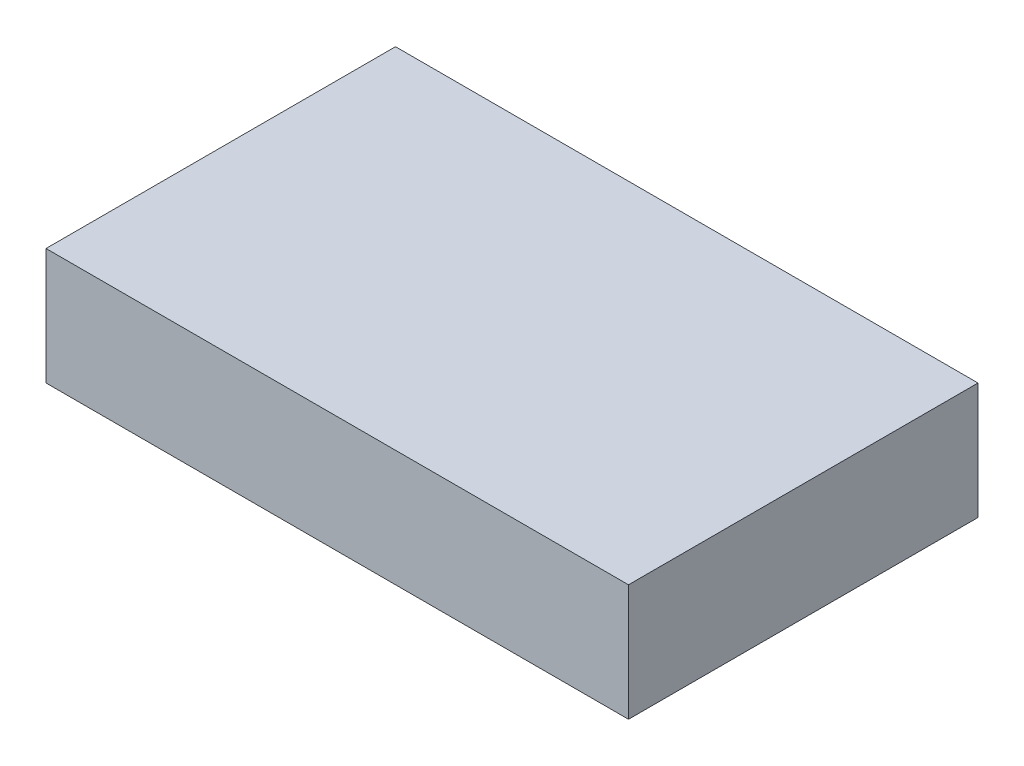
ISO-10303-21;
HEADER;
FILE_DESCRIPTION(('STEP AP214'),'2;1');
FILE_NAME('part.step','',(''),(''),'','','');
FILE_SCHEMA(('AUTOMOTIVE_DESIGN { 1 0 10303 214 1 1 1 1 }'));
ENDSEC;
DATA;
#1=APPLICATION_CONTEXT('core data for automotive mechanical design processes');
#2=APPLICATION_PROTOCOL_DEFINITION('international standard','automotive_design',2000,#1);
#3=PRODUCT_CONTEXT('',#1,'mechanical');
#4=PRODUCT('Part','Part','',(#3));
#5=PRODUCT_RELATED_PRODUCT_CATEGORY('part','',(#4));
#6=PRODUCT_DEFINITION_FORMATION('','',#4);
#7=PRODUCT_DEFINITION_CONTEXT('part definition',#1,'design');
#8=PRODUCT_DEFINITION('design','',#6,#7);
#9=PRODUCT_DEFINITION_SHAPE('','',#8);
#10=(LENGTH_UNIT() NAMED_UNIT(*) SI_UNIT(.MILLI.,.METRE.));
#11=(NAMED_UNIT(*) PLANE_ANGLE_UNIT() SI_UNIT($,.RADIAN.));
#12=(NAMED_UNIT(*) SI_UNIT($,.STERADIAN.) SOLID_ANGLE_UNIT());
#13=UNCERTAINTY_MEASURE_WITH_UNIT(LENGTH_MEASURE(1.E-05),#10,'distance_accuracy_value','');
#14=(GEOMETRIC_REPRESENTATION_CONTEXT(3) GLOBAL_UNCERTAINTY_ASSIGNED_CONTEXT((#13)) GLOBAL_UNIT_ASSIGNED_CONTEXT((#10,
#11,#12)) REPRESENTATION_CONTEXT('',''));
#15=CARTESIAN_POINT('',(0.,0.,0.));
#16=DIRECTION('',(0.,0.,1.));
#17=DIRECTION('',(1.,0.,0.));
#18=AXIS2_PLACEMENT_3D('',#15,#16,#17);
#19=CARTESIAN_POINT('',(0.,12.7,0.));
#20=DIRECTION('',(1.,0.,0.));
#21=DIRECTION('',(0.,0.,-1.));
#22=AXIS2_PLACEMENT_3D('',#19,#20,#21);
#23=PLANE('',#22);
#24=DIRECTION('',(0.,0.,1.));
#25=VECTOR('',#24,1.);
#26=CARTESIAN_POINT('',(0.,0.,0.));
#27=LINE('',#26,#25);
#28=CARTESIAN_POINT('',(0.,0.,-38.1));
#29=VERTEX_POINT('',#28);
#30=CARTESIAN_POINT('',(0.,0.,0.));
#31=VERTEX_POINT('',#30);
#32=EDGE_CURVE('E96',#29,#31,#27,.T.);
#33=ORIENTED_EDGE('',*,*,#32,.T.);
#34=DIRECTION('',(0.,-1.,0.));
#35=VECTOR('',#34,1.);
#36=CARTESIAN_POINT('',(0.,12.7,0.));
#37=LINE('',#36,#35);
#38=CARTESIAN_POINT('',(0.,12.7,0.));
#39=VERTEX_POINT('',#38);
#40=EDGE_CURVE('E11',#39,#31,#37,.T.);
#41=ORIENTED_EDGE('',*,*,#40,.F.);
#42=DIRECTION('',(0.,0.,1.));
#43=VECTOR('',#42,1.);
#44=CARTESIAN_POINT('',(0.,12.7,0.));
#45=LINE('',#44,#43);
#46=CARTESIAN_POINT('',(0.,12.7,-38.1));
#47=VERTEX_POINT('',#46);
#48=EDGE_CURVE('E84',#47,#39,#45,.T.);
#49=ORIENTED_EDGE('',*,*,#48,.F.);
#50=DIRECTION('',(0.,-1.,0.));
#51=VECTOR('',#50,1.);
#52=CARTESIAN_POINT('',(0.,12.7,-38.1));
#53=LINE('',#52,#51);
#54=EDGE_CURVE('E92',#47,#29,#53,.T.);
#55=ORIENTED_EDGE('',*,*,#54,.T.);
#56=EDGE_LOOP('',(#33,#41,#49,#55));
#57=FACE_BOUND('',#56,.T.);
#58=ADVANCED_FACE('F33',(#57),#23,.F.);
#59=CARTESIAN_POINT('',(0.,12.7,0.));
#60=DIRECTION('',(0.,0.,-1.));
#61=DIRECTION('',(-1.,0.,0.));
#62=AXIS2_PLACEMENT_3D('',#59,#60,#61);
#63=PLANE('',#62);
#64=DIRECTION('',(1.,0.,0.));
#65=VECTOR('',#64,1.);
#66=CARTESIAN_POINT('',(0.,0.,0.));
#67=LINE('',#66,#65);
#68=CARTESIAN_POINT('',(63.5,0.,0.));
#69=VERTEX_POINT('',#68);
#70=EDGE_CURVE('E88',#31,#69,#67,.T.);
#71=ORIENTED_EDGE('',*,*,#70,.T.);
#72=DIRECTION('',(0.,-1.,0.));
#73=VECTOR('',#72,1.);
#74=CARTESIAN_POINT('',(63.5,12.7,0.));
#75=LINE('',#74,#73);
#76=CARTESIAN_POINT('',(63.5,12.7,0.));
#77=VERTEX_POINT('',#76);
#78=EDGE_CURVE('E41',#77,#69,#75,.T.);
#79=ORIENTED_EDGE('',*,*,#78,.F.);
#80=DIRECTION('',(1.,0.,0.));
#81=VECTOR('',#80,1.);
#82=CARTESIAN_POINT('',(0.,12.7,0.));
#83=LINE('',#82,#81);
#84=EDGE_CURVE('E79',#39,#77,#83,.T.);
#85=ORIENTED_EDGE('',*,*,#84,.F.);
#86=ORIENTED_EDGE('',*,*,#40,.T.);
#87=EDGE_LOOP('',(#71,#79,#85,#86));
#88=FACE_BOUND('',#87,.T.);
#89=ADVANCED_FACE('F87',(#88),#63,.F.);
#90=CARTESIAN_POINT('',(63.5,12.7,0.));
#91=DIRECTION('',(-1.,0.,0.));
#92=DIRECTION('',(0.,0.,1.));
#93=AXIS2_PLACEMENT_3D('',#90,#91,#92);
#94=PLANE('',#93);
#95=DIRECTION('',(0.,0.,-1.));
#96=VECTOR('',#95,1.);
#97=CARTESIAN_POINT('',(63.5,0.,0.));
#98=LINE('',#97,#96);
#99=CARTESIAN_POINT('',(63.5,0.,-38.1));
#100=VERTEX_POINT('',#99);
#101=EDGE_CURVE('E66',#69,#100,#98,.T.);
#102=ORIENTED_EDGE('',*,*,#101,.T.);
#103=DIRECTION('',(0.,-1.,0.));
#104=VECTOR('',#103,1.);
#105=CARTESIAN_POINT('',(63.5,12.7,-38.1));
#106=LINE('',#105,#104);
#107=CARTESIAN_POINT('',(63.5,12.7,-38.1));
#108=VERTEX_POINT('',#107);
#109=EDGE_CURVE('E89',#108,#100,#106,.T.);
#110=ORIENTED_EDGE('',*,*,#109,.F.);
#111=DIRECTION('',(0.,0.,-1.));
#112=VECTOR('',#111,1.);
#113=CARTESIAN_POINT('',(63.5,12.7,0.));
#114=LINE('',#113,#112);
#115=EDGE_CURVE('E82',#77,#108,#114,.T.);
#116=ORIENTED_EDGE('',*,*,#115,.F.);
#117=ORIENTED_EDGE('',*,*,#78,.T.);
#118=EDGE_LOOP('',(#102,#110,#116,#117));
#119=FACE_BOUND('',#118,.T.);
#120=ADVANCED_FACE('F90',(#119),#94,.F.);
#121=CARTESIAN_POINT('',(0.,12.7,-38.1));
#122=DIRECTION('',(0.,0.,1.));
#123=DIRECTION('',(1.,0.,0.));
#124=AXIS2_PLACEMENT_3D('',#121,#122,#123);
#125=PLANE('',#124);
#126=DIRECTION('',(-1.,0.,0.));
#127=VECTOR('',#126,1.);
#128=CARTESIAN_POINT('',(0.,0.,-38.1));
#129=LINE('',#128,#127);
#130=EDGE_CURVE('E72',#100,#29,#129,.T.);
#131=ORIENTED_EDGE('',*,*,#130,.T.);
#132=ORIENTED_EDGE('',*,*,#54,.F.);
#133=DIRECTION('',(-1.,0.,0.));
#134=VECTOR('',#133,1.);
#135=CARTESIAN_POINT('',(0.,12.7,-38.1));
#136=LINE('',#135,#134);
#137=EDGE_CURVE('E49',#108,#47,#136,.T.);
#138=ORIENTED_EDGE('',*,*,#137,.F.);
#139=ORIENTED_EDGE('',*,*,#109,.T.);
#140=EDGE_LOOP('',(#131,#132,#138,#139));
#141=FACE_BOUND('',#140,.T.);
#142=ADVANCED_FACE('F103',(#141),#125,.F.);
#143=CARTESIAN_POINT('',(0.,12.7,0.));
#144=DIRECTION('',(0.,-1.,0.));
#145=DIRECTION('',(0.,0.,-1.));
#146=AXIS2_PLACEMENT_3D('',#143,#144,#145);
#147=PLANE('',#146);
#148=ORIENTED_EDGE('',*,*,#48,.T.);
#149=ORIENTED_EDGE('',*,*,#84,.T.);
#150=ORIENTED_EDGE('',*,*,#115,.T.);
#151=ORIENTED_EDGE('',*,*,#137,.T.);
#152=EDGE_LOOP('',(#148,#149,#150,#151));
#153=FACE_BOUND('',#152,.T.);
#154=ADVANCED_FACE('F80',(#153),#147,.F.);
#155=CARTESIAN_POINT('',(0.,0.,0.));
#156=DIRECTION('',(0.,-1.,0.));
#157=DIRECTION('',(0.,0.,-1.));
#158=AXIS2_PLACEMENT_3D('',#155,#156,#157);
#159=PLANE('',#158);
#160=ORIENTED_EDGE('',*,*,#32,.F.);
#161=ORIENTED_EDGE('',*,*,#130,.F.);
#162=ORIENTED_EDGE('',*,*,#101,.F.);
#163=ORIENTED_EDGE('',*,*,#70,.F.);
#164=EDGE_LOOP('',(#160,#161,#162,#163));
#165=FACE_BOUND('',#164,.T.);
#166=ADVANCED_FACE('F106',(#165),#159,.T.);
#167=CLOSED_SHELL('',(#58,#89,#120,#142,#154,#166));
#168=MANIFOLD_SOLID_BREP('B2',#167);
#169=ADVANCED_BREP_SHAPE_REPRESENTATION('',(#18,#168),#14);
#170=SHAPE_DEFINITION_REPRESENTATION(#9,#169);
ENDSEC;
END-ISO-10303-21;
